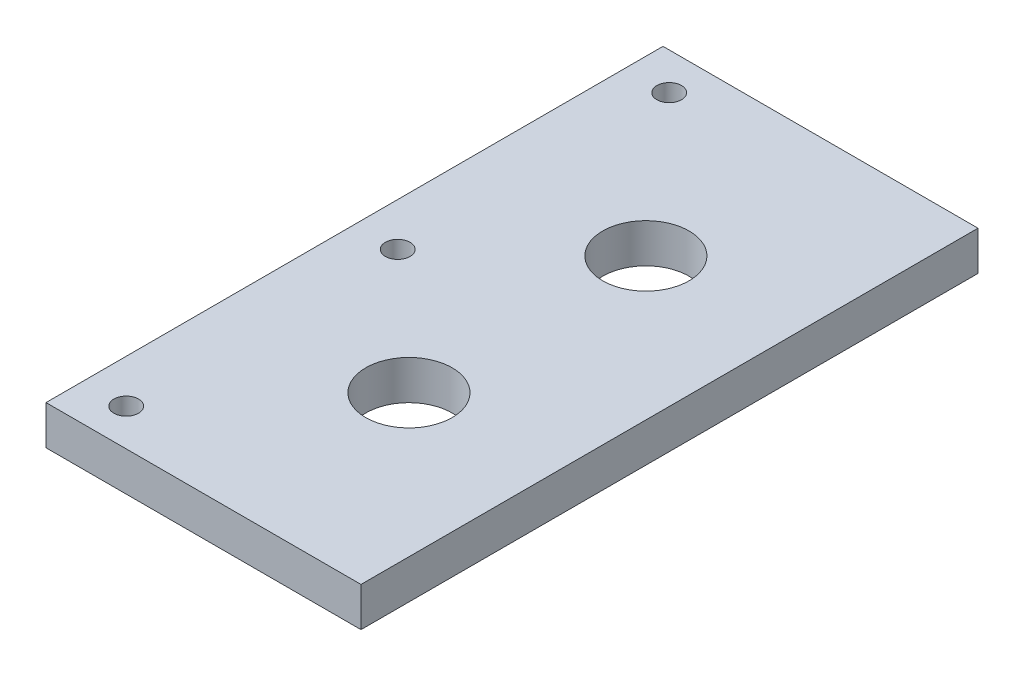
ISO-10303-21;
HEADER;
FILE_DESCRIPTION(('STEP AP214'),'2;1');
FILE_NAME('part.step','',(''),(''),'','','');
FILE_SCHEMA(('AUTOMOTIVE_DESIGN { 1 0 10303 214 1 1 1 1 }'));
ENDSEC;
DATA;
#1=APPLICATION_CONTEXT('core data for automotive mechanical design processes');
#2=APPLICATION_PROTOCOL_DEFINITION('international standard','automotive_design',2000,#1);
#3=PRODUCT_CONTEXT('',#1,'mechanical');
#4=PRODUCT('Part','Part','',(#3));
#5=PRODUCT_RELATED_PRODUCT_CATEGORY('part','',(#4));
#6=PRODUCT_DEFINITION_FORMATION('','',#4);
#7=PRODUCT_DEFINITION_CONTEXT('part definition',#1,'design');
#8=PRODUCT_DEFINITION('design','',#6,#7);
#9=PRODUCT_DEFINITION_SHAPE('','',#8);
#10=(LENGTH_UNIT() NAMED_UNIT(*) SI_UNIT(.MILLI.,.METRE.));
#11=(NAMED_UNIT(*) PLANE_ANGLE_UNIT() SI_UNIT($,.RADIAN.));
#12=(NAMED_UNIT(*) SI_UNIT($,.STERADIAN.) SOLID_ANGLE_UNIT());
#13=UNCERTAINTY_MEASURE_WITH_UNIT(LENGTH_MEASURE(1.E-05),#10,'distance_accuracy_value','');
#14=(GEOMETRIC_REPRESENTATION_CONTEXT(3) GLOBAL_UNCERTAINTY_ASSIGNED_CONTEXT((#13)) GLOBAL_UNIT_ASSIGNED_CONTEXT((#10,
#11,#12)) REPRESENTATION_CONTEXT('',''));
#15=CARTESIAN_POINT('',(0.,0.,0.));
#16=DIRECTION('',(0.,0.,1.));
#17=DIRECTION('',(1.,0.,0.));
#18=AXIS2_PLACEMENT_3D('',#15,#16,#17);
#19=CARTESIAN_POINT('',(0.,6.35,0.));
#20=DIRECTION('',(0.,0.,-1.));
#21=DIRECTION('',(-1.,0.,0.));
#22=AXIS2_PLACEMENT_3D('',#19,#20,#21);
#23=PLANE('',#22);
#24=DIRECTION('',(1.,0.,0.));
#25=VECTOR('',#24,1.);
#26=CARTESIAN_POINT('',(0.,0.,0.));
#27=LINE('',#26,#25);
#28=CARTESIAN_POINT('',(-5.,0.,0.));
#29=VERTEX_POINT('',#28);
#30=CARTESIAN_POINT('',(46.0505357971883,0.,0.));
#31=VERTEX_POINT('',#30);
#32=EDGE_CURVE('E114',#29,#31,#27,.T.);
#33=ORIENTED_EDGE('',*,*,#32,.T.);
#34=DIRECTION('',(0.,-1.,0.));
#35=VECTOR('',#34,1.);
#36=CARTESIAN_POINT('',(46.0505357971883,6.35,0.));
#37=LINE('',#36,#35);
#38=CARTESIAN_POINT('',(46.0505357971883,6.35,0.));
#39=VERTEX_POINT('',#38);
#40=EDGE_CURVE('E11',#39,#31,#37,.T.);
#41=ORIENTED_EDGE('',*,*,#40,.F.);
#42=DIRECTION('',(1.,0.,0.));
#43=VECTOR('',#42,1.);
#44=CARTESIAN_POINT('',(0.,6.35,0.));
#45=LINE('',#44,#43);
#46=CARTESIAN_POINT('',(-5.,6.35,0.));
#47=VERTEX_POINT('',#46);
#48=EDGE_CURVE('E84',#47,#39,#45,.T.);
#49=ORIENTED_EDGE('',*,*,#48,.F.);
#50=DIRECTION('',(0.,-1.,0.));
#51=VECTOR('',#50,1.);
#52=CARTESIAN_POINT('',(-5.,6.35,0.));
#53=LINE('',#52,#51);
#54=EDGE_CURVE('E104',#47,#29,#53,.T.);
#55=ORIENTED_EDGE('',*,*,#54,.T.);
#56=EDGE_LOOP('',(#33,#41,#49,#55));
#57=FACE_BOUND('',#56,.T.);
#58=ADVANCED_FACE('F35',(#57),#23,.F.);
#59=CARTESIAN_POINT('',(46.0505357971883,6.35,0.));
#60=DIRECTION('',(-1.,0.,0.));
#61=DIRECTION('',(0.,0.,1.));
#62=AXIS2_PLACEMENT_3D('',#59,#60,#61);
#63=PLANE('',#62);
#64=DIRECTION('',(0.,0.,-1.));
#65=VECTOR('',#64,1.);
#66=CARTESIAN_POINT('',(46.0505357971883,0.,0.));
#67=LINE('',#66,#65);
#68=CARTESIAN_POINT('',(46.0505357971883,0.,-100.));
#69=VERTEX_POINT('',#68);
#70=EDGE_CURVE('E89',#31,#69,#67,.T.);
#71=ORIENTED_EDGE('',*,*,#70,.T.);
#72=DIRECTION('',(0.,-1.,0.));
#73=VECTOR('',#72,1.);
#74=CARTESIAN_POINT('',(46.0505357971883,6.35,-100.));
#75=LINE('',#74,#73);
#76=CARTESIAN_POINT('',(46.0505357971883,6.35,-100.));
#77=VERTEX_POINT('',#76);
#78=EDGE_CURVE('E44',#77,#69,#75,.T.);
#79=ORIENTED_EDGE('',*,*,#78,.F.);
#80=DIRECTION('',(0.,0.,-1.));
#81=VECTOR('',#80,1.);
#82=CARTESIAN_POINT('',(46.0505357971883,6.35,0.));
#83=LINE('',#82,#81);
#84=EDGE_CURVE('E78',#39,#77,#83,.T.);
#85=ORIENTED_EDGE('',*,*,#84,.F.);
#86=ORIENTED_EDGE('',*,*,#40,.T.);
#87=EDGE_LOOP('',(#71,#79,#85,#86));
#88=FACE_BOUND('',#87,.T.);
#89=ADVANCED_FACE('F88',(#88),#63,.F.);
#90=CARTESIAN_POINT('',(0.,6.35,-100.));
#91=DIRECTION('',(0.,0.,-1.));
#92=DIRECTION('',(-1.,0.,0.));
#93=AXIS2_PLACEMENT_3D('',#90,#91,#92);
#94=PLANE('',#93);
#95=DIRECTION('',(1.,0.,0.));
#96=VECTOR('',#95,1.);
#97=CARTESIAN_POINT('',(0.,0.,-100.));
#98=LINE('',#97,#96);
#99=CARTESIAN_POINT('',(-5.,0.,-100.));
#100=VERTEX_POINT('',#99);
#101=EDGE_CURVE('E118',#100,#69,#98,.T.);
#102=ORIENTED_EDGE('',*,*,#101,.F.);
#103=DIRECTION('',(0.,-1.,0.));
#104=VECTOR('',#103,1.);
#105=CARTESIAN_POINT('',(-5.,6.35,-100.));
#106=LINE('',#105,#104);
#107=CARTESIAN_POINT('',(-5.,6.35,-100.));
#108=VERTEX_POINT('',#107);
#109=EDGE_CURVE('E68',#108,#100,#106,.T.);
#110=ORIENTED_EDGE('',*,*,#109,.F.);
#111=DIRECTION('',(1.,0.,0.));
#112=VECTOR('',#111,1.);
#113=CARTESIAN_POINT('',(0.,6.35,-100.));
#114=LINE('',#113,#112);
#115=EDGE_CURVE('E82',#108,#77,#114,.T.);
#116=ORIENTED_EDGE('',*,*,#115,.T.);
#117=ORIENTED_EDGE('',*,*,#78,.T.);
#118=EDGE_LOOP('',(#102,#110,#116,#117));
#119=FACE_BOUND('',#118,.T.);
#120=ADVANCED_FACE('F93',(#119),#94,.T.);
#121=CARTESIAN_POINT('',(23.0252678985941,6.35,-69.2));
#122=DIRECTION('',(0.,-1.,0.));
#123=DIRECTION('',(0.,0.,-1.));
#124=AXIS2_PLACEMENT_3D('',#121,#122,#123);
#125=CYLINDRICAL_SURFACE('',#124,7.);
#126=CARTESIAN_POINT('',(23.0252678985941,6.35,-69.2));
#127=DIRECTION('',(0.,1.,0.));
#128=DIRECTION('',(0.,0.,1.));
#129=AXIS2_PLACEMENT_3D('',#126,#127,#128);
#130=CIRCLE('',#129,7.);
#131=CARTESIAN_POINT('',(23.0252678985941,6.35,-62.2));
#132=VERTEX_POINT('',#131);
#133=EDGE_CURVE('E95',#132,#132,#130,.T.);
#134=ORIENTED_EDGE('',*,*,#133,.T.);
#135=EDGE_LOOP('',(#134));
#136=FACE_BOUND('',#135,.T.);
#137=CARTESIAN_POINT('',(23.0252678985941,0.,-69.2));
#138=DIRECTION('',(0.,1.,0.));
#139=DIRECTION('',(0.,0.,1.));
#140=AXIS2_PLACEMENT_3D('',#137,#138,#139);
#141=CIRCLE('',#140,7.);
#142=CARTESIAN_POINT('',(23.0252678985941,0.,-62.2));
#143=VERTEX_POINT('',#142);
#144=EDGE_CURVE('E121',#143,#143,#141,.T.);
#145=ORIENTED_EDGE('',*,*,#144,.F.);
#146=EDGE_LOOP('',(#145));
#147=FACE_BOUND('',#146,.T.);
#148=ADVANCED_FACE('F283',(#136,#147),#125,.F.);
#149=CARTESIAN_POINT('',(-5.,6.35,0.));
#150=DIRECTION('',(1.,0.,0.));
#151=DIRECTION('',(0.,0.,-1.));
#152=AXIS2_PLACEMENT_3D('',#149,#150,#151);
#153=PLANE('',#152);
#154=DIRECTION('',(0.,0.,1.));
#155=VECTOR('',#154,1.);
#156=CARTESIAN_POINT('',(-5.,0.,0.));
#157=LINE('',#156,#155);
#158=EDGE_CURVE('E71',#100,#29,#157,.T.);
#159=ORIENTED_EDGE('',*,*,#158,.T.);
#160=ORIENTED_EDGE('',*,*,#54,.F.);
#161=DIRECTION('',(0.,0.,1.));
#162=VECTOR('',#161,1.);
#163=CARTESIAN_POINT('',(-5.,6.35,0.));
#164=LINE('',#163,#162);
#165=EDGE_CURVE('E52',#108,#47,#164,.T.);
#166=ORIENTED_EDGE('',*,*,#165,.F.);
#167=ORIENTED_EDGE('',*,*,#109,.T.);
#168=EDGE_LOOP('',(#159,#160,#166,#167));
#169=FACE_BOUND('',#168,.T.);
#170=ADVANCED_FACE('F164',(#169),#153,.F.);
#171=CARTESIAN_POINT('',(2.,6.35,-94.));
#172=DIRECTION('',(0.,-1.,0.));
#173=DIRECTION('',(0.,0.,-1.));
#174=AXIS2_PLACEMENT_3D('',#171,#172,#173);
#175=CYLINDRICAL_SURFACE('',#174,2.);
#176=CARTESIAN_POINT('',(2.,6.35,-94.));
#177=DIRECTION('',(0.,1.,0.));
#178=DIRECTION('',(0.,0.,1.));
#179=AXIS2_PLACEMENT_3D('',#176,#177,#178);
#180=CIRCLE('',#179,2.);
#181=CARTESIAN_POINT('',(2.,6.35,-92.));
#182=VERTEX_POINT('',#181);
#183=EDGE_CURVE('E180',#182,#182,#180,.T.);
#184=ORIENTED_EDGE('',*,*,#183,.T.);
#185=EDGE_LOOP('',(#184));
#186=FACE_BOUND('',#185,.T.);
#187=CARTESIAN_POINT('',(2.,0.,-94.));
#188=DIRECTION('',(0.,1.,0.));
#189=DIRECTION('',(0.,0.,1.));
#190=AXIS2_PLACEMENT_3D('',#187,#188,#189);
#191=CIRCLE('',#190,2.);
#192=CARTESIAN_POINT('',(2.,0.,-92.));
#193=VERTEX_POINT('',#192);
#194=EDGE_CURVE('E111',#193,#193,#191,.T.);
#195=ORIENTED_EDGE('',*,*,#194,.F.);
#196=EDGE_LOOP('',(#195));
#197=FACE_BOUND('',#196,.T.);
#198=ADVANCED_FACE('F162',(#186,#197),#175,.F.);
#199=CARTESIAN_POINT('',(2.,6.35,-50.));
#200=DIRECTION('',(0.,-1.,0.));
#201=DIRECTION('',(0.,0.,-1.));
#202=AXIS2_PLACEMENT_3D('',#199,#200,#201);
#203=CYLINDRICAL_SURFACE('',#202,2.);
#204=CARTESIAN_POINT('',(2.,6.35,-50.));
#205=DIRECTION('',(0.,1.,0.));
#206=DIRECTION('',(0.,0.,1.));
#207=AXIS2_PLACEMENT_3D('',#204,#205,#206);
#208=CIRCLE('',#207,2.);
#209=CARTESIAN_POINT('',(2.,6.35,-48.));
#210=VERTEX_POINT('',#209);
#211=EDGE_CURVE('E173',#210,#210,#208,.T.);
#212=ORIENTED_EDGE('',*,*,#211,.T.);
#213=EDGE_LOOP('',(#212));
#214=FACE_BOUND('',#213,.T.);
#215=CARTESIAN_POINT('',(2.,0.,-50.));
#216=DIRECTION('',(0.,1.,0.));
#217=DIRECTION('',(0.,0.,1.));
#218=AXIS2_PLACEMENT_3D('',#215,#216,#217);
#219=CIRCLE('',#218,2.);
#220=CARTESIAN_POINT('',(2.,0.,-48.));
#221=VERTEX_POINT('',#220);
#222=EDGE_CURVE('E108',#221,#221,#219,.T.);
#223=ORIENTED_EDGE('',*,*,#222,.F.);
#224=EDGE_LOOP('',(#223));
#225=FACE_BOUND('',#224,.T.);
#226=ADVANCED_FACE('F151',(#214,#225),#203,.F.);
#227=CARTESIAN_POINT('',(2.,6.35,-6.));
#228=DIRECTION('',(0.,-1.,0.));
#229=DIRECTION('',(0.,0.,-1.));
#230=AXIS2_PLACEMENT_3D('',#227,#228,#229);
#231=CYLINDRICAL_SURFACE('',#230,2.);
#232=CARTESIAN_POINT('',(2.,6.35,-6.));
#233=DIRECTION('',(0.,1.,0.));
#234=DIRECTION('',(0.,0.,1.));
#235=AXIS2_PLACEMENT_3D('',#232,#233,#234);
#236=CIRCLE('',#235,2.);
#237=CARTESIAN_POINT('',(2.,6.35,-4.));
#238=VERTEX_POINT('',#237);
#239=EDGE_CURVE('E127',#238,#238,#236,.T.);
#240=ORIENTED_EDGE('',*,*,#239,.T.);
#241=EDGE_LOOP('',(#240));
#242=FACE_BOUND('',#241,.T.);
#243=CARTESIAN_POINT('',(2.,0.,-6.));
#244=DIRECTION('',(0.,1.,0.));
#245=DIRECTION('',(0.,0.,1.));
#246=AXIS2_PLACEMENT_3D('',#243,#244,#245);
#247=CIRCLE('',#246,2.);
#248=CARTESIAN_POINT('',(2.,0.,-4.));
#249=VERTEX_POINT('',#248);
#250=EDGE_CURVE('E105',#249,#249,#247,.T.);
#251=ORIENTED_EDGE('',*,*,#250,.F.);
#252=EDGE_LOOP('',(#251));
#253=FACE_BOUND('',#252,.T.);
#254=ADVANCED_FACE('F37',(#242,#253),#231,.F.);
#255=CARTESIAN_POINT('',(23.0252678985941,6.35,-30.8));
#256=DIRECTION('',(0.,-1.,0.));
#257=DIRECTION('',(0.,0.,-1.));
#258=AXIS2_PLACEMENT_3D('',#255,#256,#257);
#259=CYLINDRICAL_SURFACE('',#258,7.);
#260=CARTESIAN_POINT('',(23.0252678985941,6.35,-30.8));
#261=DIRECTION('',(0.,1.,0.));
#262=DIRECTION('',(0.,0.,1.));
#263=AXIS2_PLACEMENT_3D('',#260,#261,#262);
#264=CIRCLE('',#263,7.);
#265=CARTESIAN_POINT('',(23.0252678985941,6.35,-23.8));
#266=VERTEX_POINT('',#265);
#267=EDGE_CURVE('E101',#266,#266,#264,.T.);
#268=ORIENTED_EDGE('',*,*,#267,.T.);
#269=EDGE_LOOP('',(#268));
#270=FACE_BOUND('',#269,.T.);
#271=CARTESIAN_POINT('',(23.0252678985941,0.,-30.8));
#272=DIRECTION('',(0.,1.,0.));
#273=DIRECTION('',(0.,0.,1.));
#274=AXIS2_PLACEMENT_3D('',#271,#272,#273);
#275=CIRCLE('',#274,7.);
#276=CARTESIAN_POINT('',(23.0252678985941,0.,-23.8));
#277=VERTEX_POINT('',#276);
#278=EDGE_CURVE('E124',#277,#277,#275,.T.);
#279=ORIENTED_EDGE('',*,*,#278,.F.);
#280=EDGE_LOOP('',(#279));
#281=FACE_BOUND('',#280,.T.);
#282=ADVANCED_FACE('F141',(#270,#281),#259,.F.);
#283=CARTESIAN_POINT('',(0.,6.35,0.));
#284=DIRECTION('',(0.,1.,0.));
#285=DIRECTION('',(0.,0.,1.));
#286=AXIS2_PLACEMENT_3D('',#283,#284,#285);
#287=PLANE('',#286);
#288=ORIENTED_EDGE('',*,*,#239,.F.);
#289=EDGE_LOOP('',(#288));
#290=FACE_BOUND('',#289,.T.);
#291=ORIENTED_EDGE('',*,*,#211,.F.);
#292=EDGE_LOOP('',(#291));
#293=FACE_BOUND('',#292,.T.);
#294=ORIENTED_EDGE('',*,*,#183,.F.);
#295=EDGE_LOOP('',(#294));
#296=FACE_BOUND('',#295,.T.);
#297=ORIENTED_EDGE('',*,*,#48,.T.);
#298=ORIENTED_EDGE('',*,*,#84,.T.);
#299=ORIENTED_EDGE('',*,*,#115,.F.);
#300=ORIENTED_EDGE('',*,*,#165,.T.);
#301=EDGE_LOOP('',(#297,#298,#299,#300));
#302=FACE_BOUND('',#301,.T.);
#303=ORIENTED_EDGE('',*,*,#133,.F.);
#304=EDGE_LOOP('',(#303));
#305=FACE_BOUND('',#304,.T.);
#306=ORIENTED_EDGE('',*,*,#267,.F.);
#307=EDGE_LOOP('',(#306));
#308=FACE_BOUND('',#307,.T.);
#309=ADVANCED_FACE('F79',(#290,#293,#296,#302,#305,#308),#287,.T.);
#310=CARTESIAN_POINT('',(0.,0.,0.));
#311=DIRECTION('',(0.,1.,0.));
#312=DIRECTION('',(0.,0.,1.));
#313=AXIS2_PLACEMENT_3D('',#310,#311,#312);
#314=PLANE('',#313);
#315=ORIENTED_EDGE('',*,*,#250,.T.);
#316=EDGE_LOOP('',(#315));
#317=FACE_BOUND('',#316,.T.);
#318=ORIENTED_EDGE('',*,*,#222,.T.);
#319=EDGE_LOOP('',(#318));
#320=FACE_BOUND('',#319,.T.);
#321=ORIENTED_EDGE('',*,*,#194,.T.);
#322=EDGE_LOOP('',(#321));
#323=FACE_BOUND('',#322,.T.);
#324=ORIENTED_EDGE('',*,*,#32,.F.);
#325=ORIENTED_EDGE('',*,*,#158,.F.);
#326=ORIENTED_EDGE('',*,*,#101,.T.);
#327=ORIENTED_EDGE('',*,*,#70,.F.);
#328=EDGE_LOOP('',(#324,#325,#326,#327));
#329=FACE_BOUND('',#328,.T.);
#330=ORIENTED_EDGE('',*,*,#144,.T.);
#331=EDGE_LOOP('',(#330));
#332=FACE_BOUND('',#331,.T.);
#333=ORIENTED_EDGE('',*,*,#278,.T.);
#334=EDGE_LOOP('',(#333));
#335=FACE_BOUND('',#334,.T.);
#336=ADVANCED_FACE('F132',(#317,#320,#323,#329,#332,#335),#314,.F.);
#337=CLOSED_SHELL('',(#58,#89,#120,#148,#170,#198,#226,#254,#282,#309,#336));
#338=MANIFOLD_SOLID_BREP('B2',#337);
#339=ADVANCED_BREP_SHAPE_REPRESENTATION('',(#18,#338),#14);
#340=SHAPE_DEFINITION_REPRESENTATION(#9,#339);
ENDSEC;
END-ISO-10303-21;
